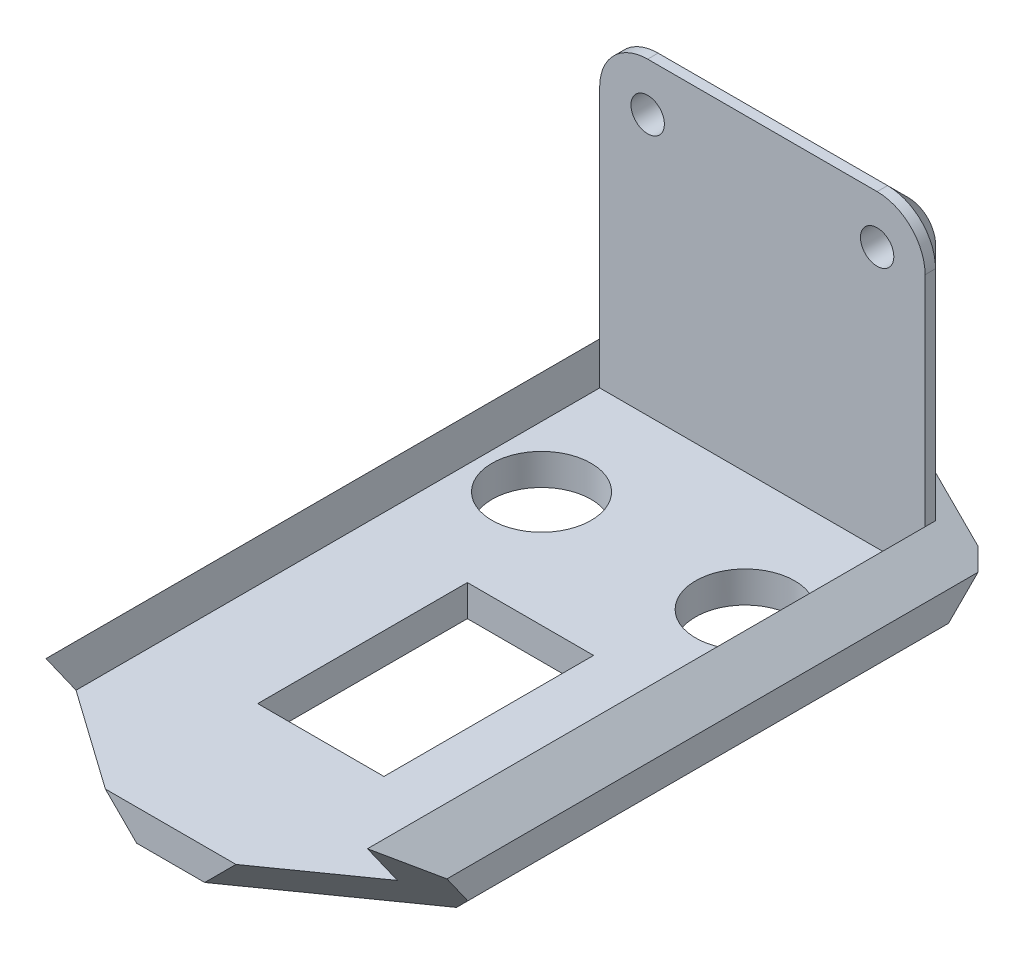
ISO-10303-21;
HEADER;
FILE_DESCRIPTION(('STEP AP214'),'2;1');
FILE_NAME('part.step','',(''),(''),'','','');
FILE_SCHEMA(('AUTOMOTIVE_DESIGN { 1 0 10303 214 1 1 1 1 }'));
ENDSEC;
DATA;
#1=APPLICATION_CONTEXT('core data for automotive mechanical design processes');
#2=APPLICATION_PROTOCOL_DEFINITION('international standard','automotive_design',2000,#1);
#3=PRODUCT_CONTEXT('',#1,'mechanical');
#4=PRODUCT('Part','Part','',(#3));
#5=PRODUCT_RELATED_PRODUCT_CATEGORY('part','',(#4));
#6=PRODUCT_DEFINITION_FORMATION('','',#4);
#7=PRODUCT_DEFINITION_CONTEXT('part definition',#1,'design');
#8=PRODUCT_DEFINITION('design','',#6,#7);
#9=PRODUCT_DEFINITION_SHAPE('','',#8);
#10=(LENGTH_UNIT() NAMED_UNIT(*) SI_UNIT(.MILLI.,.METRE.));
#11=(NAMED_UNIT(*) PLANE_ANGLE_UNIT() SI_UNIT($,.RADIAN.));
#12=(NAMED_UNIT(*) SI_UNIT($,.STERADIAN.) SOLID_ANGLE_UNIT());
#13=UNCERTAINTY_MEASURE_WITH_UNIT(LENGTH_MEASURE(1.E-05),#10,'distance_accuracy_value','');
#14=(GEOMETRIC_REPRESENTATION_CONTEXT(3) GLOBAL_UNCERTAINTY_ASSIGNED_CONTEXT((#13)) GLOBAL_UNIT_ASSIGNED_CONTEXT((#10,
#11,#12)) REPRESENTATION_CONTEXT('',''));
#15=CARTESIAN_POINT('',(0.,0.,0.));
#16=DIRECTION('',(0.,0.,1.));
#17=DIRECTION('',(1.,0.,0.));
#18=AXIS2_PLACEMENT_3D('',#15,#16,#17);
#19=CARTESIAN_POINT('',(0.,-25.,60.));
#20=DIRECTION('',(0.,-1.,0.));
#21=DIRECTION('',(0.,0.,-1.));
#22=AXIS2_PLACEMENT_3D('',#19,#20,#21);
#23=PLANE('',#22);
#24=CARTESIAN_POINT('',(9.76118306580784,-25.,14.4137382743566));
#25=DIRECTION('',(0.,-1.,0.));
#26=DIRECTION('',(0.,0.,-1.));
#27=AXIS2_PLACEMENT_3D('',#24,#25,#26);
#28=CIRCLE('',#27,4.75);
#29=CARTESIAN_POINT('',(9.76118306580784,-25.,9.66373827435661));
#30=VERTEX_POINT('',#29);
#31=EDGE_CURVE('E235',#30,#30,#28,.T.);
#32=ORIENTED_EDGE('',*,*,#31,.T.);
#33=EDGE_LOOP('',(#32));
#34=FACE_BOUND('',#33,.T.);
#35=CARTESIAN_POINT('',(-9.76118306580783,-25.,14.4137382743566));
#36=DIRECTION('',(0.,-1.,0.));
#37=DIRECTION('',(0.,0.,-1.));
#38=AXIS2_PLACEMENT_3D('',#35,#36,#37);
#39=CIRCLE('',#38,4.75);
#40=CARTESIAN_POINT('',(-9.76118306580783,-25.,9.66373827435661));
#41=VERTEX_POINT('',#40);
#42=EDGE_CURVE('E238',#41,#41,#39,.T.);
#43=ORIENTED_EDGE('',*,*,#42,.T.);
#44=EDGE_LOOP('',(#43));
#45=FACE_BOUND('',#44,.T.);
#46=DIRECTION('',(0.,0.,-1.));
#47=VECTOR('',#46,1.);
#48=CARTESIAN_POINT('',(-15.6,-25.,60.));
#49=LINE('',#48,#47);
#50=CARTESIAN_POINT('',(-15.6,-25.,53.2071067811864));
#51=VERTEX_POINT('',#50);
#52=CARTESIAN_POINT('',(-15.6,-25.,3.));
#53=VERTEX_POINT('',#52);
#54=EDGE_CURVE('E283',#51,#53,#49,.T.);
#55=ORIENTED_EDGE('',*,*,#54,.F.);
#56=DIRECTION('',(-0.81649658092773,0.,-0.57735026918962));
#57=VECTOR('',#56,1.);
#58=CARTESIAN_POINT('',(-12.3289321881343,-25.,55.5201010126776));
#59=LINE('',#58,#57);
#60=CARTESIAN_POINT('',(-5.99339828220145,-25.,60.));
#61=VERTEX_POINT('',#60);
#62=EDGE_CURVE('E416',#51,#61,#59,.F.);
#63=ORIENTED_EDGE('',*,*,#62,.T.);
#64=DIRECTION('',(-1.,0.,0.));
#65=VECTOR('',#64,1.);
#66=CARTESIAN_POINT('',(0.,-25.,60.));
#67=LINE('',#66,#65);
#68=CARTESIAN_POINT('',(6.52893218813444,-25.,60.));
#69=VERTEX_POINT('',#68);
#70=EDGE_CURVE('E276',#69,#61,#67,.T.);
#71=ORIENTED_EDGE('',*,*,#70,.F.);
#72=DIRECTION('',(0.816496580927725,0.,-0.577350269189628));
#73=VECTOR('',#72,1.);
#74=CARTESIAN_POINT('',(12.6859547920897,-25.,55.6463275648244));
#75=LINE('',#74,#73);
#76=CARTESIAN_POINT('',(15.6,-25.,53.5857864376268));
#77=VERTEX_POINT('',#76);
#78=EDGE_CURVE('E414',#69,#77,#75,.T.);
#79=ORIENTED_EDGE('',*,*,#78,.T.);
#80=DIRECTION('',(0.,0.,-1.));
#81=VECTOR('',#80,1.);
#82=CARTESIAN_POINT('',(15.6,-25.,60.));
#83=LINE('',#82,#81);
#84=CARTESIAN_POINT('',(15.6,-25.,3.));
#85=VERTEX_POINT('',#84);
#86=EDGE_CURVE('E282',#77,#85,#83,.T.);
#87=ORIENTED_EDGE('',*,*,#86,.T.);
#88=DIRECTION('',(1.,0.,0.));
#89=VECTOR('',#88,1.);
#90=CARTESIAN_POINT('',(0.,-25.,3.));
#91=LINE('',#90,#89);
#92=EDGE_CURVE('E296',#53,#85,#91,.T.);
#93=ORIENTED_EDGE('',*,*,#92,.F.);
#94=EDGE_LOOP('',(#55,#63,#71,#79,#87,#93));
#95=FACE_BOUND('',#94,.T.);
#96=DIRECTION('',(-1.,0.,0.));
#97=VECTOR('',#96,1.);
#98=CARTESIAN_POINT('',(0.,-25.,25.5031202897224));
#99=LINE('',#98,#97);
#100=CARTESIAN_POINT('',(6.31776695296641,-25.,25.5031202897224));
#101=VERTEX_POINT('',#100);
#102=CARTESIAN_POINT('',(-5.78223304703358,-25.,25.5031202897224));
#103=VERTEX_POINT('',#102);
#104=EDGE_CURVE('E216',#101,#103,#99,.T.);
#105=ORIENTED_EDGE('',*,*,#104,.F.);
#106=DIRECTION('',(0.,0.,-1.));
#107=VECTOR('',#106,1.);
#108=CARTESIAN_POINT('',(6.31776695296641,-25.,60.));
#109=LINE('',#108,#107);
#110=CARTESIAN_POINT('',(6.31776695296641,-25.,45.6031202897224));
#111=VERTEX_POINT('',#110);
#112=EDGE_CURVE('E219',#111,#101,#109,.T.);
#113=ORIENTED_EDGE('',*,*,#112,.F.);
#114=DIRECTION('',(-1.,0.,0.));
#115=VECTOR('',#114,1.);
#116=CARTESIAN_POINT('',(0.,-25.,45.6031202897224));
#117=LINE('',#116,#115);
#118=CARTESIAN_POINT('',(-5.78223304703358,-25.,45.6031202897224));
#119=VERTEX_POINT('',#118);
#120=EDGE_CURVE('E250',#111,#119,#117,.T.);
#121=ORIENTED_EDGE('',*,*,#120,.T.);
#122=DIRECTION('',(0.,0.,-1.));
#123=VECTOR('',#122,1.);
#124=CARTESIAN_POINT('',(-5.78223304703358,-25.,60.));
#125=LINE('',#124,#123);
#126=EDGE_CURVE('E253',#119,#103,#125,.T.);
#127=ORIENTED_EDGE('',*,*,#126,.T.);
#128=EDGE_LOOP('',(#105,#113,#121,#127));
#129=FACE_BOUND('',#128,.T.);
#130=ADVANCED_FACE('F41',(#34,#45,#95,#129),#23,.F.);
#131=CARTESIAN_POINT('',(0.,-28.,60.));
#132=DIRECTION('',(0.,1.,0.));
#133=DIRECTION('',(-1.,0.,0.));
#134=AXIS2_PLACEMENT_3D('',#131,#132,#133);
#135=PLANE('',#134);
#136=CARTESIAN_POINT('',(9.76118306580784,-28.,14.4137382743566));
#137=DIRECTION('',(0.,-1.,0.));
#138=DIRECTION('',(1.,0.,0.));
#139=AXIS2_PLACEMENT_3D('',#136,#137,#138);
#140=CIRCLE('',#139,4.75);
#141=CARTESIAN_POINT('',(14.5111830658078,-28.,14.4137382743566));
#142=VERTEX_POINT('',#141);
#143=EDGE_CURVE('E970',#142,#142,#140,.T.);
#144=ORIENTED_EDGE('',*,*,#143,.F.);
#145=EDGE_LOOP('',(#144));
#146=FACE_BOUND('',#145,.T.);
#147=CARTESIAN_POINT('',(-9.76118306580783,-28.,14.4137382743566));
#148=DIRECTION('',(0.,-1.,0.));
#149=DIRECTION('',(-1.,0.,0.));
#150=AXIS2_PLACEMENT_3D('',#147,#148,#149);
#151=CIRCLE('',#150,4.75);
#152=CARTESIAN_POINT('',(-14.5111830658078,-28.,14.4137382743566));
#153=VERTEX_POINT('',#152);
#154=EDGE_CURVE('E972',#153,#153,#151,.T.);
#155=ORIENTED_EDGE('',*,*,#154,.F.);
#156=EDGE_LOOP('',(#155));
#157=FACE_BOUND('',#156,.T.);
#158=DIRECTION('',(1.,0.,0.));
#159=VECTOR('',#158,1.);
#160=CARTESIAN_POINT('',(0.,-28.,60.));
#161=LINE('',#160,#159);
#162=CARTESIAN_POINT('',(-2.99339828220144,-28.,60.));
#163=VERTEX_POINT('',#162);
#164=CARTESIAN_POINT('',(3.52893218813454,-28.,60.));
#165=VERTEX_POINT('',#164);
#166=EDGE_CURVE('E279',#163,#165,#161,.T.);
#167=ORIENTED_EDGE('',*,*,#166,.F.);
#168=DIRECTION('',(0.81649658092773,0.,0.57735026918962));
#169=VECTOR('',#168,1.);
#170=CARTESIAN_POINT('',(-11.3289321881344,-28.,54.1058874503045));
#171=LINE('',#170,#169);
#172=CARTESIAN_POINT('',(-17.1355339059327,-28.,49.9999999999999));
#173=VERTEX_POINT('',#172);
#174=EDGE_CURVE('E404',#163,#173,#171,.F.);
#175=ORIENTED_EDGE('',*,*,#174,.T.);
#176=DIRECTION('',(0.,0.,-1.));
#177=VECTOR('',#176,1.);
#178=CARTESIAN_POINT('',(-17.1355339059327,-28.,5.));
#179=LINE('',#178,#177);
#180=CARTESIAN_POINT('',(-17.1355339059327,-28.,5.));
#181=VERTEX_POINT('',#180);
#182=EDGE_CURVE('E373',#173,#181,#179,.T.);
#183=ORIENTED_EDGE('',*,*,#182,.T.);
#184=DIRECTION('',(1.,0.,0.));
#185=VECTOR('',#184,1.);
#186=CARTESIAN_POINT('',(0.,-28.,5.));
#187=LINE('',#186,#185);
#188=CARTESIAN_POINT('',(17.6710678118655,-28.,5.));
#189=VERTEX_POINT('',#188);
#190=EDGE_CURVE('E326',#181,#189,#187,.T.);
#191=ORIENTED_EDGE('',*,*,#190,.T.);
#192=DIRECTION('',(0.,0.,1.));
#193=VECTOR('',#192,1.);
#194=CARTESIAN_POINT('',(17.6710678118655,-28.,60.));
#195=LINE('',#194,#193);
#196=CARTESIAN_POINT('',(17.6710678118655,-28.,49.9999999999999));
#197=VERTEX_POINT('',#196);
#198=EDGE_CURVE('E329',#189,#197,#195,.T.);
#199=ORIENTED_EDGE('',*,*,#198,.T.);
#200=DIRECTION('',(-0.816496580927725,0.,0.577350269189628));
#201=VECTOR('',#200,1.);
#202=CARTESIAN_POINT('',(11.6859547920897,-28.,54.2321140024513));
#203=LINE('',#202,#201);
#204=EDGE_CURVE('E402',#197,#165,#203,.T.);
#205=ORIENTED_EDGE('',*,*,#204,.T.);
#206=EDGE_LOOP('',(#167,#175,#183,#191,#199,#205));
#207=FACE_BOUND('',#206,.T.);
#208=DIRECTION('',(-1.,0.,0.));
#209=VECTOR('',#208,1.);
#210=CARTESIAN_POINT('',(6.31776695296641,-28.,25.5031202897224));
#211=LINE('',#210,#209);
#212=CARTESIAN_POINT('',(6.31776695296641,-28.,25.5031202897224));
#213=VERTEX_POINT('',#212);
#214=CARTESIAN_POINT('',(-5.78223304703358,-28.,25.5031202897224));
#215=VERTEX_POINT('',#214);
#216=EDGE_CURVE('E213',#213,#215,#211,.T.);
#217=ORIENTED_EDGE('',*,*,#216,.T.);
#218=DIRECTION('',(0.,0.,-1.));
#219=VECTOR('',#218,1.);
#220=CARTESIAN_POINT('',(-5.78223304703358,-28.,45.6031202897224));
#221=LINE('',#220,#219);
#222=CARTESIAN_POINT('',(-5.78223304703358,-28.,45.6031202897224));
#223=VERTEX_POINT('',#222);
#224=EDGE_CURVE('E223',#223,#215,#221,.T.);
#225=ORIENTED_EDGE('',*,*,#224,.F.);
#226=DIRECTION('',(-1.,0.,0.));
#227=VECTOR('',#226,1.);
#228=CARTESIAN_POINT('',(6.31776695296641,-28.,45.6031202897224));
#229=LINE('',#228,#227);
#230=CARTESIAN_POINT('',(6.31776695296641,-28.,45.6031202897224));
#231=VERTEX_POINT('',#230);
#232=EDGE_CURVE('E229',#231,#223,#229,.T.);
#233=ORIENTED_EDGE('',*,*,#232,.F.);
#234=DIRECTION('',(0.,0.,-1.));
#235=VECTOR('',#234,1.);
#236=CARTESIAN_POINT('',(6.31776695296641,-28.,45.6031202897224));
#237=LINE('',#236,#235);
#238=EDGE_CURVE('E234',#231,#213,#237,.T.);
#239=ORIENTED_EDGE('',*,*,#238,.T.);
#240=EDGE_LOOP('',(#217,#225,#233,#239));
#241=FACE_BOUND('',#240,.T.);
#242=ADVANCED_FACE('F232',(#146,#157,#207,#241),#135,.F.);
#243=CARTESIAN_POINT('',(-15.6,0.,3.));
#244=DIRECTION('',(1.,0.,0.));
#245=DIRECTION('',(0.,1.,0.));
#246=AXIS2_PLACEMENT_3D('',#243,#244,#245);
#247=PLANE('',#246);
#248=DIRECTION('',(0.,0.,-1.));
#249=VECTOR('',#248,1.);
#250=CARTESIAN_POINT('',(-15.6,0.,3.));
#251=LINE('',#250,#249);
#252=CARTESIAN_POINT('',(-15.6,0.,3.));
#253=VERTEX_POINT('',#252);
#254=CARTESIAN_POINT('',(-15.6,0.,2.00000000000002));
#255=VERTEX_POINT('',#254);
#256=EDGE_CURVE('E320',#253,#255,#251,.T.);
#257=ORIENTED_EDGE('',*,*,#256,.T.);
#258=DIRECTION('',(0.,-1.,0.));
#259=VECTOR('',#258,1.);
#260=CARTESIAN_POINT('',(-15.6,0.,2.00000000000002));
#261=LINE('',#260,#259);
#262=CARTESIAN_POINT('',(-15.6,-20.9289321881346,2.00000000000002));
#263=VERTEX_POINT('',#262);
#264=EDGE_CURVE('E342',#255,#263,#261,.T.);
#265=ORIENTED_EDGE('',*,*,#264,.T.);
#266=DIRECTION('',(0.,0.,-1.));
#267=VECTOR('',#266,1.);
#268=CARTESIAN_POINT('',(-15.6,-20.9289321881346,70.));
#269=LINE('',#268,#267);
#270=CARTESIAN_POINT('',(-15.6,-20.9289321881346,3.));
#271=VERTEX_POINT('',#270);
#272=EDGE_CURVE('E260',#271,#263,#269,.T.);
#273=ORIENTED_EDGE('',*,*,#272,.F.);
#274=DIRECTION('',(0.,-1.,0.));
#275=VECTOR('',#274,1.);
#276=CARTESIAN_POINT('',(-15.6,0.,3.));
#277=LINE('',#276,#275);
#278=EDGE_CURVE('E293',#253,#271,#277,.T.);
#279=ORIENTED_EDGE('',*,*,#278,.F.);
#280=EDGE_LOOP('',(#257,#265,#273,#279));
#281=FACE_BOUND('',#280,.T.);
#282=ADVANCED_FACE('F507',(#281),#247,.F.);
#283=CARTESIAN_POINT('',(0.,4.6,3.));
#284=DIRECTION('',(0.,1.,0.));
#285=DIRECTION('',(0.,0.,1.));
#286=AXIS2_PLACEMENT_3D('',#283,#284,#285);
#287=PLANE('',#286);
#288=DIRECTION('',(0.,0.,-1.));
#289=VECTOR('',#288,1.);
#290=CARTESIAN_POINT('',(11.,4.6,3.));
#291=LINE('',#290,#289);
#292=CARTESIAN_POINT('',(11.,4.6,3.));
#293=VERTEX_POINT('',#292);
#294=CARTESIAN_POINT('',(11.,4.6,2.00000000000002));
#295=VERTEX_POINT('',#294);
#296=EDGE_CURVE('E310',#293,#295,#291,.T.);
#297=ORIENTED_EDGE('',*,*,#296,.T.);
#298=DIRECTION('',(-1.,0.,0.));
#299=VECTOR('',#298,1.);
#300=CARTESIAN_POINT('',(-11.,4.6,2.00000000000002));
#301=LINE('',#300,#299);
#302=CARTESIAN_POINT('',(-11.,4.6,2.00000000000002));
#303=VERTEX_POINT('',#302);
#304=EDGE_CURVE('E362',#295,#303,#301,.T.);
#305=ORIENTED_EDGE('',*,*,#304,.T.);
#306=DIRECTION('',(0.,0.,-1.));
#307=VECTOR('',#306,1.);
#308=CARTESIAN_POINT('',(-11.,4.6,3.));
#309=LINE('',#308,#307);
#310=CARTESIAN_POINT('',(-11.,4.6,3.));
#311=VERTEX_POINT('',#310);
#312=EDGE_CURVE('E323',#311,#303,#309,.T.);
#313=ORIENTED_EDGE('',*,*,#312,.F.);
#314=DIRECTION('',(1.,0.,0.));
#315=VECTOR('',#314,1.);
#316=CARTESIAN_POINT('',(0.,4.6,3.));
#317=LINE('',#316,#315);
#318=EDGE_CURVE('E287',#311,#293,#317,.T.);
#319=ORIENTED_EDGE('',*,*,#318,.T.);
#320=EDGE_LOOP('',(#297,#305,#313,#319));
#321=FACE_BOUND('',#320,.T.);
#322=ADVANCED_FACE('F553',(#321),#287,.T.);
#323=CARTESIAN_POINT('',(-11.,0.,3.));
#324=DIRECTION('',(0.,0.,-1.));
#325=DIRECTION('',(-1.,0.,0.));
#326=AXIS2_PLACEMENT_3D('',#323,#324,#325);
#327=CYLINDRICAL_SURFACE('',#326,4.6);
#328=ORIENTED_EDGE('',*,*,#312,.T.);
#329=CARTESIAN_POINT('',(-11.,0.,2.00000000000002));
#330=DIRECTION('',(0.,0.,1.));
#331=DIRECTION('',(1.,0.,0.));
#332=AXIS2_PLACEMENT_3D('',#329,#330,#331);
#333=CIRCLE('',#332,4.6);
#334=EDGE_CURVE('E360',#303,#255,#333,.T.);
#335=ORIENTED_EDGE('',*,*,#334,.T.);
#336=ORIENTED_EDGE('',*,*,#256,.F.);
#337=CARTESIAN_POINT('',(-11.,0.,3.));
#338=DIRECTION('',(0.,0.,1.));
#339=DIRECTION('',(1.,0.,0.));
#340=AXIS2_PLACEMENT_3D('',#337,#338,#339);
#341=CIRCLE('',#340,4.6);
#342=EDGE_CURVE('E290',#311,#253,#341,.T.);
#343=ORIENTED_EDGE('',*,*,#342,.F.);
#344=EDGE_LOOP('',(#328,#335,#336,#343));
#345=FACE_BOUND('',#344,.T.);
#346=ADVANCED_FACE('F550',(#345),#327,.T.);
#347=CARTESIAN_POINT('',(15.6,0.,3.));
#348=DIRECTION('',(1.,0.,0.));
#349=DIRECTION('',(0.,1.,0.));
#350=AXIS2_PLACEMENT_3D('',#347,#348,#349);
#351=PLANE('',#350);
#352=DIRECTION('',(0.,0.,-1.));
#353=VECTOR('',#352,1.);
#354=CARTESIAN_POINT('',(15.6,-20.9289321881346,70.));
#355=LINE('',#354,#353);
#356=CARTESIAN_POINT('',(15.6,-20.9289321881346,3.));
#357=VERTEX_POINT('',#356);
#358=CARTESIAN_POINT('',(15.6,-20.9289321881346,2.00000000000002));
#359=VERTEX_POINT('',#358);
#360=EDGE_CURVE('E270',#357,#359,#355,.T.);
#361=ORIENTED_EDGE('',*,*,#360,.T.);
#362=DIRECTION('',(0.,1.,0.));
#363=VECTOR('',#362,1.);
#364=CARTESIAN_POINT('',(15.6,0.,2.00000000000002));
#365=LINE('',#364,#363);
#366=CARTESIAN_POINT('',(15.6,0.,2.00000000000002));
#367=VERTEX_POINT('',#366);
#368=EDGE_CURVE('E366',#359,#367,#365,.T.);
#369=ORIENTED_EDGE('',*,*,#368,.T.);
#370=DIRECTION('',(0.,0.,-1.));
#371=VECTOR('',#370,1.);
#372=CARTESIAN_POINT('',(15.6,0.,3.));
#373=LINE('',#372,#371);
#374=CARTESIAN_POINT('',(15.6,0.,3.));
#375=VERTEX_POINT('',#374);
#376=EDGE_CURVE('E317',#375,#367,#373,.T.);
#377=ORIENTED_EDGE('',*,*,#376,.F.);
#378=DIRECTION('',(0.,-1.,0.));
#379=VECTOR('',#378,1.);
#380=CARTESIAN_POINT('',(15.6,0.,3.));
#381=LINE('',#380,#379);
#382=EDGE_CURVE('E299',#375,#357,#381,.T.);
#383=ORIENTED_EDGE('',*,*,#382,.T.);
#384=EDGE_LOOP('',(#361,#369,#377,#383));
#385=FACE_BOUND('',#384,.T.);
#386=ADVANCED_FACE('F460',(#385),#351,.T.);
#387=CARTESIAN_POINT('',(-11.,0.,3.));
#388=DIRECTION('',(0.,0.,-1.));
#389=DIRECTION('',(-1.,0.,0.));
#390=AXIS2_PLACEMENT_3D('',#387,#388,#389);
#391=CYLINDRICAL_SURFACE('',#390,1.6);
#392=CARTESIAN_POINT('',(-11.,0.,3.));
#393=DIRECTION('',(0.,0.,1.));
#394=DIRECTION('',(1.,0.,0.));
#395=AXIS2_PLACEMENT_3D('',#392,#393,#394);
#396=CIRCLE('',#395,1.6);
#397=CARTESIAN_POINT('',(-9.4,0.,3.));
#398=VERTEX_POINT('',#397);
#399=EDGE_CURVE('E304',#398,#398,#396,.T.);
#400=ORIENTED_EDGE('',*,*,#399,.T.);
#401=EDGE_LOOP('',(#400));
#402=FACE_BOUND('',#401,.T.);
#403=CARTESIAN_POINT('',(-11.,0.,0.));
#404=DIRECTION('',(0.,0.,1.));
#405=DIRECTION('',(1.,0.,0.));
#406=AXIS2_PLACEMENT_3D('',#403,#404,#405);
#407=CIRCLE('',#406,1.6);
#408=CARTESIAN_POINT('',(-9.4,0.,0.));
#409=VERTEX_POINT('',#408);
#410=EDGE_CURVE('E285',#409,#409,#407,.T.);
#411=ORIENTED_EDGE('',*,*,#410,.F.);
#412=EDGE_LOOP('',(#411));
#413=FACE_BOUND('',#412,.T.);
#414=ADVANCED_FACE('F541',(#402,#413),#391,.F.);
#415=CARTESIAN_POINT('',(11.,0.,3.));
#416=DIRECTION('',(0.,0.,-1.));
#417=DIRECTION('',(-1.,0.,0.));
#418=AXIS2_PLACEMENT_3D('',#415,#416,#417);
#419=CYLINDRICAL_SURFACE('',#418,4.6);
#420=ORIENTED_EDGE('',*,*,#376,.T.);
#421=CARTESIAN_POINT('',(11.,0.,2.00000000000002));
#422=DIRECTION('',(0.,0.,1.));
#423=DIRECTION('',(1.,0.,0.));
#424=AXIS2_PLACEMENT_3D('',#421,#422,#423);
#425=CIRCLE('',#424,4.6);
#426=EDGE_CURVE('E364',#367,#295,#425,.T.);
#427=ORIENTED_EDGE('',*,*,#426,.T.);
#428=ORIENTED_EDGE('',*,*,#296,.F.);
#429=CARTESIAN_POINT('',(11.,0.,3.));
#430=DIRECTION('',(0.,0.,1.));
#431=DIRECTION('',(1.,0.,0.));
#432=AXIS2_PLACEMENT_3D('',#429,#430,#431);
#433=CIRCLE('',#432,4.6);
#434=EDGE_CURVE('E302',#375,#293,#433,.T.);
#435=ORIENTED_EDGE('',*,*,#434,.F.);
#436=EDGE_LOOP('',(#420,#427,#428,#435));
#437=FACE_BOUND('',#436,.T.);
#438=ADVANCED_FACE('F539',(#437),#419,.T.);
#439=CARTESIAN_POINT('',(11.,0.,3.));
#440=DIRECTION('',(0.,0.,-1.));
#441=DIRECTION('',(-1.,0.,0.));
#442=AXIS2_PLACEMENT_3D('',#439,#440,#441);
#443=CYLINDRICAL_SURFACE('',#442,1.6);
#444=CARTESIAN_POINT('',(11.,0.,3.));
#445=DIRECTION('',(0.,0.,1.));
#446=DIRECTION('',(1.,0.,0.));
#447=AXIS2_PLACEMENT_3D('',#444,#445,#446);
#448=CIRCLE('',#447,1.6);
#449=CARTESIAN_POINT('',(12.6,0.,3.));
#450=VERTEX_POINT('',#449);
#451=EDGE_CURVE('E307',#450,#450,#448,.T.);
#452=ORIENTED_EDGE('',*,*,#451,.T.);
#453=EDGE_LOOP('',(#452));
#454=FACE_BOUND('',#453,.T.);
#455=CARTESIAN_POINT('',(11.,0.,0.));
#456=DIRECTION('',(0.,0.,1.));
#457=DIRECTION('',(1.,0.,0.));
#458=AXIS2_PLACEMENT_3D('',#455,#456,#457);
#459=CIRCLE('',#458,1.6);
#460=CARTESIAN_POINT('',(12.6,0.,0.));
#461=VERTEX_POINT('',#460);
#462=EDGE_CURVE('E291',#461,#461,#459,.T.);
#463=ORIENTED_EDGE('',*,*,#462,.F.);
#464=EDGE_LOOP('',(#463));
#465=FACE_BOUND('',#464,.T.);
#466=ADVANCED_FACE('F534',(#454,#465),#443,.F.);
#467=CARTESIAN_POINT('',(0.,0.,3.));
#468=DIRECTION('',(0.,0.,1.));
#469=DIRECTION('',(1.,0.,0.));
#470=AXIS2_PLACEMENT_3D('',#467,#468,#469);
#471=PLANE('',#470);
#472=ORIENTED_EDGE('',*,*,#318,.F.);
#473=ORIENTED_EDGE('',*,*,#342,.T.);
#474=ORIENTED_EDGE('',*,*,#278,.T.);
#475=DIRECTION('',(0.,-1.,0.));
#476=VECTOR('',#475,1.);
#477=CARTESIAN_POINT('',(-15.6,0.,3.));
#478=LINE('',#477,#476);
#479=EDGE_CURVE('E264',#271,#53,#478,.T.);
#480=ORIENTED_EDGE('',*,*,#479,.T.);
#481=ORIENTED_EDGE('',*,*,#92,.T.);
#482=DIRECTION('',(0.,1.,0.));
#483=VECTOR('',#482,1.);
#484=CARTESIAN_POINT('',(15.6,0.,3.));
#485=LINE('',#484,#483);
#486=EDGE_CURVE('E273',#85,#357,#485,.T.);
#487=ORIENTED_EDGE('',*,*,#486,.T.);
#488=ORIENTED_EDGE('',*,*,#382,.F.);
#489=ORIENTED_EDGE('',*,*,#434,.T.);
#490=EDGE_LOOP('',(#472,#473,#474,#480,#481,#487,#488,#489));
#491=FACE_BOUND('',#490,.T.);
#492=ORIENTED_EDGE('',*,*,#399,.F.);
#493=EDGE_LOOP('',(#492));
#494=FACE_BOUND('',#493,.T.);
#495=ORIENTED_EDGE('',*,*,#451,.F.);
#496=EDGE_LOOP('',(#495));
#497=FACE_BOUND('',#496,.T.);
#498=ADVANCED_FACE('F465',(#491,#494,#497),#471,.T.);
#499=CARTESIAN_POINT('',(0.,0.,0.));
#500=DIRECTION('',(0.,0.,1.));
#501=DIRECTION('',(1.,0.,0.));
#502=AXIS2_PLACEMENT_3D('',#499,#500,#501);
#503=PLANE('',#502);
#504=DIRECTION('',(-0.707106781186551,-0.707106781186544,0.));
#505=VECTOR('',#504,1.);
#506=CARTESIAN_POINT('',(2.66446609406737,-2.6644660940674,0.));
#507=LINE('',#506,#505);
#508=CARTESIAN_POINT('',(-13.6,-18.9289321881346,0.));
#509=VERTEX_POINT('',#508);
#510=CARTESIAN_POINT('',(-17.6710678118654,-23.,0.));
#511=VERTEX_POINT('',#510);
#512=EDGE_CURVE('E257',#509,#511,#507,.T.);
#513=ORIENTED_EDGE('',*,*,#512,.F.);
#514=DIRECTION('',(0.,1.,0.));
#515=VECTOR('',#514,1.);
#516=CARTESIAN_POINT('',(-13.6,0.,0.));
#517=LINE('',#516,#515);
#518=CARTESIAN_POINT('',(-13.6,0.,0.));
#519=VERTEX_POINT('',#518);
#520=EDGE_CURVE('E358',#509,#519,#517,.T.);
#521=ORIENTED_EDGE('',*,*,#520,.T.);
#522=CARTESIAN_POINT('',(-11.,0.,0.));
#523=DIRECTION('',(0.,0.,1.));
#524=DIRECTION('',(1.,0.,0.));
#525=AXIS2_PLACEMENT_3D('',#522,#523,#524);
#526=CIRCLE('',#525,2.59999999999999);
#527=CARTESIAN_POINT('',(-11.,2.59999999999999,0.));
#528=VERTEX_POINT('',#527);
#529=EDGE_CURVE('E356',#519,#528,#526,.F.);
#530=ORIENTED_EDGE('',*,*,#529,.T.);
#531=DIRECTION('',(1.,0.,0.));
#532=VECTOR('',#531,1.);
#533=CARTESIAN_POINT('',(11.,2.59999999999999,0.));
#534=LINE('',#533,#532);
#535=CARTESIAN_POINT('',(11.,2.59999999999999,0.));
#536=VERTEX_POINT('',#535);
#537=EDGE_CURVE('E354',#528,#536,#534,.T.);
#538=ORIENTED_EDGE('',*,*,#537,.T.);
#539=CARTESIAN_POINT('',(11.,0.,0.));
#540=DIRECTION('',(0.,0.,1.));
#541=DIRECTION('',(1.,0.,0.));
#542=AXIS2_PLACEMENT_3D('',#539,#540,#541);
#543=CIRCLE('',#542,2.59999999999999);
#544=CARTESIAN_POINT('',(13.6,0.,0.));
#545=VERTEX_POINT('',#544);
#546=EDGE_CURVE('E352',#536,#545,#543,.F.);
#547=ORIENTED_EDGE('',*,*,#546,.T.);
#548=DIRECTION('',(0.,-1.,0.));
#549=VECTOR('',#548,1.);
#550=CARTESIAN_POINT('',(13.6,-20.9289321881346,0.));
#551=LINE('',#550,#549);
#552=CARTESIAN_POINT('',(13.6,-18.9289321881346,0.));
#553=VERTEX_POINT('',#552);
#554=EDGE_CURVE('E349',#545,#553,#551,.T.);
#555=ORIENTED_EDGE('',*,*,#554,.T.);
#556=DIRECTION('',(0.707106781186551,-0.707106781186544,0.));
#557=VECTOR('',#556,1.);
#558=CARTESIAN_POINT('',(-2.66446609406737,-2.6644660940674,0.));
#559=LINE('',#558,#557);
#560=CARTESIAN_POINT('',(17.6710678118654,-23.,0.));
#561=VERTEX_POINT('',#560);
#562=EDGE_CURVE('E267',#553,#561,#559,.T.);
#563=ORIENTED_EDGE('',*,*,#562,.T.);
#564=DIRECTION('',(-1.,0.,0.));
#565=VECTOR('',#564,1.);
#566=CARTESIAN_POINT('',(0.,-23.,0.));
#567=LINE('',#566,#565);
#568=EDGE_CURVE('E334',#561,#511,#567,.T.);
#569=ORIENTED_EDGE('',*,*,#568,.T.);
#570=EDGE_LOOP('',(#513,#521,#530,#538,#547,#555,#563,#569));
#571=FACE_BOUND('',#570,.T.);
#572=ORIENTED_EDGE('',*,*,#410,.T.);
#573=EDGE_LOOP('',(#572));
#574=FACE_BOUND('',#573,.T.);
#575=ORIENTED_EDGE('',*,*,#462,.T.);
#576=EDGE_LOOP('',(#575));
#577=FACE_BOUND('',#576,.T.);
#578=ADVANCED_FACE('F450',(#571,#574,#577),#503,.F.);
#579=CARTESIAN_POINT('',(0.,0.,60.));
#580=DIRECTION('',(0.,0.,-1.));
#581=DIRECTION('',(-1.,0.,0.));
#582=AXIS2_PLACEMENT_3D('',#579,#580,#581);
#583=PLANE('',#582);
#584=ORIENTED_EDGE('',*,*,#70,.T.);
#585=DIRECTION('',(0.70710678118655,-0.707106781186545,0.));
#586=VECTOR('',#585,1.);
#587=CARTESIAN_POINT('',(-10.0644660940671,-20.9289321881344,60.));
#588=LINE('',#587,#586);
#589=EDGE_CURVE('E399',#61,#163,#588,.T.);
#590=ORIENTED_EDGE('',*,*,#589,.T.);
#591=ORIENTED_EDGE('',*,*,#166,.T.);
#592=DIRECTION('',(0.707106781186537,0.707106781186558,0.));
#593=VECTOR('',#592,1.);
#594=CARTESIAN_POINT('',(11.6857864376267,-19.8431457505076,60.));
#595=LINE('',#594,#593);
#596=EDGE_CURVE('E396',#165,#69,#595,.T.);
#597=ORIENTED_EDGE('',*,*,#596,.T.);
#598=EDGE_LOOP('',(#584,#590,#591,#597));
#599=FACE_BOUND('',#598,.T.);
#600=ADVANCED_FACE('F476',(#599),#583,.F.);
#601=CARTESIAN_POINT('',(-2.66446609406737,-2.6644660940674,70.));
#602=DIRECTION('',(0.707106781186544,0.707106781186551,0.));
#603=DIRECTION('',(-0.707106781186551,0.707106781186544,0.));
#604=AXIS2_PLACEMENT_3D('',#601,#602,#603);
#605=PLANE('',#604);
#606=CARTESIAN_POINT('',(15.6,-20.9289321881346,56.4644660940671));
#607=VERTEX_POINT('',#606);
#608=EDGE_CURVE('E271',#607,#357,#355,.T.);
#609=ORIENTED_EDGE('',*,*,#608,.F.);
#610=DIRECTION('',(0.500000000000005,-0.5,-0.707106781186544));
#611=VECTOR('',#610,1.);
#612=CARTESIAN_POINT('',(1.68223304703339,-7.0111652351681,76.1471608769002));
#613=LINE('',#612,#611);
#614=CARTESIAN_POINT('',(18.7568542494923,-24.0857864376269,51.9999999999999));
#615=VERTEX_POINT('',#614);
#616=EDGE_CURVE('E64',#607,#615,#613,.T.);
#617=ORIENTED_EDGE('',*,*,#616,.T.);
#618=DIRECTION('',(0.,0.,-1.));
#619=VECTOR('',#618,1.);
#620=CARTESIAN_POINT('',(18.7568542494923,-24.0857864376269,70.));
#621=LINE('',#620,#619);
#622=CARTESIAN_POINT('',(18.7568542494923,-24.0857864376269,1.08578643762689));
#623=VERTEX_POINT('',#622);
#624=EDGE_CURVE('E390',#615,#623,#621,.T.);
#625=ORIENTED_EDGE('',*,*,#624,.T.);
#626=DIRECTION('',(0.577350269189631,-0.577350269189625,0.577350269189622));
#627=VECTOR('',#626,1.);
#628=CARTESIAN_POINT('',(27.4473785412435,-32.776310729378,9.77631072937794));
#629=LINE('',#628,#627);
#630=EDGE_CURVE('E332',#623,#561,#629,.F.);
#631=ORIENTED_EDGE('',*,*,#630,.T.);
#632=ORIENTED_EDGE('',*,*,#562,.F.);
#633=DIRECTION('',(0.577350269189627,-0.577350269189621,0.577350269189629));
#634=VECTOR('',#633,1.);
#635=CARTESIAN_POINT('',(7.2903559372885,-12.6192881254232,-6.30964406271151));
#636=LINE('',#635,#634);
#637=EDGE_CURVE('E371',#553,#359,#636,.T.);
#638=ORIENTED_EDGE('',*,*,#637,.T.);
#639=ORIENTED_EDGE('',*,*,#360,.F.);
#640=EDGE_LOOP('',(#609,#617,#625,#631,#632,#638,#639));
#641=FACE_BOUND('',#640,.T.);
#642=ADVANCED_FACE('F427',(#641),#605,.T.);
#643=CARTESIAN_POINT('',(15.6,0.,70.));
#644=DIRECTION('',(1.,0.,0.));
#645=DIRECTION('',(0.,1.,0.));
#646=AXIS2_PLACEMENT_3D('',#643,#644,#645);
#647=PLANE('',#646);
#648=ORIENTED_EDGE('',*,*,#86,.F.);
#649=DIRECTION('',(0.,0.816496580927733,0.577350269189616));
#650=VECTOR('',#649,1.);
#651=CARTESIAN_POINT('',(15.6,-15.8192881254226,60.0775300602602));
#652=LINE('',#651,#650);
#653=EDGE_CURVE('E418',#77,#607,#652,.T.);
#654=ORIENTED_EDGE('',*,*,#653,.T.);
#655=ORIENTED_EDGE('',*,*,#608,.T.);
#656=ORIENTED_EDGE('',*,*,#486,.F.);
#657=EDGE_LOOP('',(#648,#654,#655,#656));
#658=FACE_BOUND('',#657,.T.);
#659=ADVANCED_FACE('F423',(#658),#647,.F.);
#660=CARTESIAN_POINT('',(-15.6,0.,70.));
#661=DIRECTION('',(-1.,0.,0.));
#662=DIRECTION('',(0.,-1.,0.));
#663=AXIS2_PLACEMENT_3D('',#660,#661,#662);
#664=PLANE('',#663);
#665=CARTESIAN_POINT('',(-15.6,-20.9289321881346,56.0857864376267));
#666=VERTEX_POINT('',#665);
#667=EDGE_CURVE('E262',#666,#271,#269,.T.);
#668=ORIENTED_EDGE('',*,*,#667,.F.);
#669=DIRECTION('',(0.,0.816496580927728,0.577350269189623));
#670=VECTOR('',#669,1.);
#671=CARTESIAN_POINT('',(-15.6,-15.4622655214677,59.9513035081133));
#672=LINE('',#671,#670);
#673=EDGE_CURVE('E412',#666,#51,#672,.F.);
#674=ORIENTED_EDGE('',*,*,#673,.T.);
#675=ORIENTED_EDGE('',*,*,#54,.T.);
#676=ORIENTED_EDGE('',*,*,#479,.F.);
#677=EDGE_LOOP('',(#668,#674,#675,#676));
#678=FACE_BOUND('',#677,.T.);
#679=ADVANCED_FACE('F511',(#678),#664,.F.);
#680=CARTESIAN_POINT('',(2.66446609406737,-2.6644660940674,70.));
#681=DIRECTION('',(0.707106781186544,-0.707106781186551,0.));
#682=DIRECTION('',(0.707106781186551,0.707106781186544,0.));
#683=AXIS2_PLACEMENT_3D('',#680,#681,#682);
#684=PLANE('',#683);
#685=DIRECTION('',(0.,0.,1.));
#686=VECTOR('',#685,1.);
#687=CARTESIAN_POINT('',(-19.1355339059327,-24.4644660940673,70.));
#688=LINE('',#687,#686);
#689=CARTESIAN_POINT('',(-19.1355339059327,-24.4644660940673,1.46446609406728));
#690=VERTEX_POINT('',#689);
#691=CARTESIAN_POINT('',(-19.1355339059327,-24.4644660940673,51.0857864376268));
#692=VERTEX_POINT('',#691);
#693=EDGE_CURVE('E336',#690,#692,#688,.T.);
#694=ORIENTED_EDGE('',*,*,#693,.T.);
#695=DIRECTION('',(-0.500000000000005,-0.5,-0.707106781186544));
#696=VECTOR('',#695,1.);
#697=CARTESIAN_POINT('',(-12.8322330470335,-18.1611652351681,60.));
#698=LINE('',#697,#696);
#699=EDGE_CURVE('E410',#692,#666,#698,.F.);
#700=ORIENTED_EDGE('',*,*,#699,.T.);
#701=ORIENTED_EDGE('',*,*,#667,.T.);
#702=ORIENTED_EDGE('',*,*,#272,.T.);
#703=DIRECTION('',(-0.577350269189627,-0.577350269189621,0.577350269189629));
#704=VECTOR('',#703,1.);
#705=CARTESIAN_POINT('',(-26.0903559372887,-31.4192881254231,12.4903559372887));
#706=LINE('',#705,#704);
#707=EDGE_CURVE('E368',#263,#509,#706,.F.);
#708=ORIENTED_EDGE('',*,*,#707,.T.);
#709=ORIENTED_EDGE('',*,*,#512,.T.);
#710=DIRECTION('',(0.577350269189631,0.577350269189624,-0.577350269189622));
#711=VECTOR('',#710,1.);
#712=CARTESIAN_POINT('',(-15.1140452079102,-20.4429773960448,-2.55702260395518));
#713=LINE('',#712,#711);
#714=EDGE_CURVE('E339',#511,#690,#713,.F.);
#715=ORIENTED_EDGE('',*,*,#714,.T.);
#716=EDGE_LOOP('',(#694,#700,#701,#702,#708,#709,#715));
#717=FACE_BOUND('',#716,.T.);
#718=ADVANCED_FACE('F491',(#717),#684,.F.);
#719=CARTESIAN_POINT('',(-19.1355339059327,-28.,60.));
#720=DIRECTION('',(1.,0.,0.));
#721=DIRECTION('',(0.,0.,-1.));
#722=AXIS2_PLACEMENT_3D('',#719,#720,#721);
#723=PLANE('',#722);
#724=DIRECTION('',(0.,0.,-1.));
#725=VECTOR('',#724,1.);
#726=CARTESIAN_POINT('',(-19.1355339059327,-26.,60.));
#727=LINE('',#726,#725);
#728=CARTESIAN_POINT('',(-19.1355339059327,-26.,3.));
#729=VERTEX_POINT('',#728);
#730=CARTESIAN_POINT('',(-19.1355339059327,-26.,49.9999999999999));
#731=VERTEX_POINT('',#730);
#732=EDGE_CURVE('E387',#729,#731,#727,.F.);
#733=ORIENTED_EDGE('',*,*,#732,.T.);
#734=DIRECTION('',(0.,0.816496580927729,0.577350269189621));
#735=VECTOR('',#734,1.);
#736=CARTESIAN_POINT('',(-19.1355339059327,-22.619288125423,52.3905242917512));
#737=LINE('',#736,#735);
#738=EDGE_CURVE('E408',#731,#692,#737,.T.);
#739=ORIENTED_EDGE('',*,*,#738,.T.);
#740=ORIENTED_EDGE('',*,*,#693,.F.);
#741=DIRECTION('',(0.,-0.707106781186549,0.707106781186546));
#742=VECTOR('',#741,1.);
#743=CARTESIAN_POINT('',(-19.1355339059325,-55.5,32.4999999999999));
#744=LINE('',#743,#742);
#745=EDGE_CURVE('E261',#729,#690,#744,.F.);
#746=ORIENTED_EDGE('',*,*,#745,.F.);
#747=EDGE_LOOP('',(#733,#739,#740,#746));
#748=FACE_BOUND('',#747,.T.);
#749=ADVANCED_FACE('F489',(#748),#723,.F.);
#750=CARTESIAN_POINT('',(20.1710678118655,-25.5,70.));
#751=DIRECTION('',(0.707106781186558,-0.707106781186537,0.));
#752=DIRECTION('',(0.,0.,1.));
#753=AXIS2_PLACEMENT_3D('',#750,#751,#752);
#754=PLANE('',#753);
#755=DIRECTION('',(0.,0.,1.));
#756=VECTOR('',#755,1.);
#757=CARTESIAN_POINT('',(18.7568542494924,-26.9142135623731,70.));
#758=LINE('',#757,#756);
#759=CARTESIAN_POINT('',(18.7568542494924,-26.9142135623731,3.91421356237311));
#760=VERTEX_POINT('',#759);
#761=CARTESIAN_POINT('',(18.7568542494924,-26.9142135623731,49.9999999999999));
#762=VERTEX_POINT('',#761);
#763=EDGE_CURVE('E394',#760,#762,#758,.T.);
#764=ORIENTED_EDGE('',*,*,#763,.T.);
#765=DIRECTION('',(-0.707106781186537,-0.707106781186558,0.));
#766=VECTOR('',#765,1.);
#767=CARTESIAN_POINT('',(17.6710678118655,-28.,49.9999999999999));
#768=LINE('',#767,#766);
#769=EDGE_CURVE('E11',#762,#197,#768,.T.);
#770=ORIENTED_EDGE('',*,*,#769,.T.);
#771=ORIENTED_EDGE('',*,*,#198,.F.);
#772=DIRECTION('',(-0.577350269189615,-0.577350269189633,0.57735026918963));
#773=VECTOR('',#772,1.);
#774=CARTESIAN_POINT('',(-2.32893218813428,-48.0000000000004,25.0000000000003));
#775=LINE('',#774,#773);
#776=EDGE_CURVE('E343',#760,#189,#775,.T.);
#777=ORIENTED_EDGE('',*,*,#776,.F.);
#778=EDGE_LOOP('',(#764,#770,#771,#777));
#779=FACE_BOUND('',#778,.T.);
#780=ADVANCED_FACE('F434',(#779),#754,.T.);
#781=CARTESIAN_POINT('',(0.,-28.,5.));
#782=DIRECTION('',(0.,0.707106781186546,0.707106781186549));
#783=DIRECTION('',(1.,0.,0.));
#784=AXIS2_PLACEMENT_3D('',#781,#782,#783);
#785=PLANE('',#784);
#786=ORIENTED_EDGE('',*,*,#630,.F.);
#787=DIRECTION('',(0.,-0.707106781186549,0.707106781186546));
#788=VECTOR('',#787,1.);
#789=CARTESIAN_POINT('',(18.7568542494924,-27.9999999999999,4.9999999999999));
#790=LINE('',#789,#788);
#791=EDGE_CURVE('E392',#623,#760,#790,.T.);
#792=ORIENTED_EDGE('',*,*,#791,.T.);
#793=ORIENTED_EDGE('',*,*,#776,.T.);
#794=ORIENTED_EDGE('',*,*,#190,.F.);
#795=DIRECTION('',(-0.577350269189629,0.577350269189625,-0.577350269189623));
#796=VECTOR('',#795,1.);
#797=CARTESIAN_POINT('',(-11.4236892706217,-33.7118446353109,10.7118446353109));
#798=LINE('',#797,#796);
#799=EDGE_CURVE('E385',#181,#729,#798,.T.);
#800=ORIENTED_EDGE('',*,*,#799,.T.);
#801=ORIENTED_EDGE('',*,*,#745,.T.);
#802=ORIENTED_EDGE('',*,*,#714,.F.);
#803=ORIENTED_EDGE('',*,*,#568,.F.);
#804=EDGE_LOOP('',(#786,#792,#793,#794,#800,#801,#802,#803));
#805=FACE_BOUND('',#804,.T.);
#806=ADVANCED_FACE('F443',(#805),#785,.F.);
#807=CARTESIAN_POINT('',(13.6,0.,0.));
#808=DIRECTION('',(0.707106781186549,0.,-0.707106781186546));
#809=DIRECTION('',(0.,1.,0.));
#810=AXIS2_PLACEMENT_3D('',#807,#808,#809);
#811=PLANE('',#810);
#812=ORIENTED_EDGE('',*,*,#637,.F.);
#813=ORIENTED_EDGE('',*,*,#554,.F.);
#814=DIRECTION('',(-0.707106781186546,0.,-0.707106781186549));
#815=VECTOR('',#814,1.);
#816=CARTESIAN_POINT('',(15.6,0.,2.00000000000002));
#817=LINE('',#816,#815);
#818=EDGE_CURVE('E345',#367,#545,#817,.T.);
#819=ORIENTED_EDGE('',*,*,#818,.F.);
#820=ORIENTED_EDGE('',*,*,#368,.F.);
#821=EDGE_LOOP('',(#812,#813,#819,#820));
#822=FACE_BOUND('',#821,.T.);
#823=ADVANCED_FACE('F458',(#822),#811,.T.);
#824=CARTESIAN_POINT('',(11.,0.,2.00000000000002));
#825=DIRECTION('',(0.,0.,1.));
#826=DIRECTION('',(1.,0.,0.));
#827=AXIS2_PLACEMENT_3D('',#824,#825,#826);
#828=CONICAL_SURFACE('',#827,4.6,0.785398163397447);
#829=ORIENTED_EDGE('',*,*,#818,.T.);
#830=ORIENTED_EDGE('',*,*,#546,.F.);
#831=DIRECTION('',(0.,-0.707106781186546,-0.707106781186549));
#832=VECTOR('',#831,1.);
#833=CARTESIAN_POINT('',(11.,4.6,2.00000000000002));
#834=LINE('',#833,#832);
#835=EDGE_CURVE('E379',#295,#536,#834,.T.);
#836=ORIENTED_EDGE('',*,*,#835,.F.);
#837=ORIENTED_EDGE('',*,*,#426,.F.);
#838=EDGE_LOOP('',(#829,#830,#836,#837));
#839=FACE_BOUND('',#838,.T.);
#840=ADVANCED_FACE('F594',(#839),#828,.T.);
#841=CARTESIAN_POINT('',(0.,2.59999999999999,0.));
#842=DIRECTION('',(0.,0.707106781186549,-0.707106781186546));
#843=DIRECTION('',(-1.,0.,0.));
#844=AXIS2_PLACEMENT_3D('',#841,#842,#843);
#845=PLANE('',#844);
#846=ORIENTED_EDGE('',*,*,#835,.T.);
#847=ORIENTED_EDGE('',*,*,#537,.F.);
#848=DIRECTION('',(0.,-0.707106781186546,-0.707106781186549));
#849=VECTOR('',#848,1.);
#850=CARTESIAN_POINT('',(-11.,4.6,2.00000000000002));
#851=LINE('',#850,#849);
#852=EDGE_CURVE('E376',#303,#528,#851,.T.);
#853=ORIENTED_EDGE('',*,*,#852,.F.);
#854=ORIENTED_EDGE('',*,*,#304,.F.);
#855=EDGE_LOOP('',(#846,#847,#853,#854));
#856=FACE_BOUND('',#855,.T.);
#857=ADVANCED_FACE('F588',(#856),#845,.T.);
#858=CARTESIAN_POINT('',(-11.,0.,2.00000000000002));
#859=DIRECTION('',(0.,0.,1.));
#860=DIRECTION('',(1.,0.,0.));
#861=AXIS2_PLACEMENT_3D('',#858,#859,#860);
#862=CONICAL_SURFACE('',#861,4.6,0.785398163397447);
#863=ORIENTED_EDGE('',*,*,#852,.T.);
#864=ORIENTED_EDGE('',*,*,#529,.F.);
#865=DIRECTION('',(0.707106781186546,0.,-0.707106781186549));
#866=VECTOR('',#865,1.);
#867=CARTESIAN_POINT('',(-15.6,0.,2.00000000000002));
#868=LINE('',#867,#866);
#869=EDGE_CURVE('E256',#255,#519,#868,.T.);
#870=ORIENTED_EDGE('',*,*,#869,.F.);
#871=ORIENTED_EDGE('',*,*,#334,.F.);
#872=EDGE_LOOP('',(#863,#864,#870,#871));
#873=FACE_BOUND('',#872,.T.);
#874=ADVANCED_FACE('F500',(#873),#862,.T.);
#875=CARTESIAN_POINT('',(-15.6,0.,2.00000000000002));
#876=DIRECTION('',(0.707106781186549,0.,0.707106781186546));
#877=DIRECTION('',(0.,-1.,0.));
#878=AXIS2_PLACEMENT_3D('',#875,#876,#877);
#879=PLANE('',#878);
#880=ORIENTED_EDGE('',*,*,#869,.T.);
#881=ORIENTED_EDGE('',*,*,#520,.F.);
#882=ORIENTED_EDGE('',*,*,#707,.F.);
#883=ORIENTED_EDGE('',*,*,#264,.F.);
#884=EDGE_LOOP('',(#880,#881,#882,#883));
#885=FACE_BOUND('',#884,.T.);
#886=ADVANCED_FACE('F504',(#885),#879,.F.);
#887=CARTESIAN_POINT('',(-17.1355339059327,-28.,60.));
#888=DIRECTION('',(0.707106781186545,0.70710678118655,0.));
#889=DIRECTION('',(0.,0.,-1.));
#890=AXIS2_PLACEMENT_3D('',#887,#888,#889);
#891=PLANE('',#890);
#892=ORIENTED_EDGE('',*,*,#182,.F.);
#893=DIRECTION('',(0.70710678118655,-0.707106781186545,0.));
#894=VECTOR('',#893,1.);
#895=CARTESIAN_POINT('',(-19.1355339059327,-26.,49.9999999999999));
#896=LINE('',#895,#894);
#897=EDGE_CURVE('E406',#173,#731,#896,.F.);
#898=ORIENTED_EDGE('',*,*,#897,.T.);
#899=ORIENTED_EDGE('',*,*,#732,.F.);
#900=ORIENTED_EDGE('',*,*,#799,.F.);
#901=EDGE_LOOP('',(#892,#898,#899,#900));
#902=FACE_BOUND('',#901,.T.);
#903=ADVANCED_FACE('F481',(#902),#891,.F.);
#904=CARTESIAN_POINT('',(18.7568542494923,-24.0857864376269,70.));
#905=DIRECTION('',(-1.,0.,0.));
#906=DIRECTION('',(0.,0.,-1.));
#907=AXIS2_PLACEMENT_3D('',#904,#905,#906);
#908=PLANE('',#907);
#909=ORIENTED_EDGE('',*,*,#624,.F.);
#910=DIRECTION('',(0.,0.81649658092773,0.57735026918962));
#911=VECTOR('',#910,1.);
#912=CARTESIAN_POINT('',(18.7568542494922,-15.6005050633883,57.9999999999998));
#913=LINE('',#912,#911);
#914=EDGE_CURVE('E50',#615,#762,#913,.F.);
#915=ORIENTED_EDGE('',*,*,#914,.T.);
#916=ORIENTED_EDGE('',*,*,#763,.F.);
#917=ORIENTED_EDGE('',*,*,#791,.F.);
#918=EDGE_LOOP('',(#909,#915,#916,#917));
#919=FACE_BOUND('',#918,.T.);
#920=ADVANCED_FACE('F446',(#919),#908,.F.);
#921=CARTESIAN_POINT('',(6.31776695296642,1.99999999999999,25.5031202897224));
#922=DIRECTION('',(0.,0.,1.));
#923=DIRECTION('',(1.,0.,0.));
#924=AXIS2_PLACEMENT_3D('',#921,#922,#923);
#925=PLANE('',#924);
#926=ORIENTED_EDGE('',*,*,#104,.T.);
#927=DIRECTION('',(0.,-1.,0.));
#928=VECTOR('',#927,1.);
#929=CARTESIAN_POINT('',(-5.78223304703358,1.99999999999999,25.5031202897224));
#930=LINE('',#929,#928);
#931=EDGE_CURVE('E208',#103,#215,#930,.T.);
#932=ORIENTED_EDGE('',*,*,#931,.T.);
#933=ORIENTED_EDGE('',*,*,#216,.F.);
#934=DIRECTION('',(0.,-1.,0.));
#935=VECTOR('',#934,1.);
#936=CARTESIAN_POINT('',(6.31776695296642,1.99999999999999,25.5031202897224));
#937=LINE('',#936,#935);
#938=EDGE_CURVE('E244',#101,#213,#937,.T.);
#939=ORIENTED_EDGE('',*,*,#938,.F.);
#940=EDGE_LOOP('',(#926,#932,#933,#939));
#941=FACE_BOUND('',#940,.T.);
#942=ADVANCED_FACE('F210',(#941),#925,.T.);
#943=CARTESIAN_POINT('',(-5.78223304703358,1.99999999999999,45.6031202897224));
#944=DIRECTION('',(-1.,0.,0.));
#945=DIRECTION('',(0.,-1.,0.));
#946=AXIS2_PLACEMENT_3D('',#943,#944,#945);
#947=PLANE('',#946);
#948=DIRECTION('',(0.,-1.,0.));
#949=VECTOR('',#948,1.);
#950=CARTESIAN_POINT('',(-5.78223304703358,1.99999999999999,45.6031202897224));
#951=LINE('',#950,#949);
#952=EDGE_CURVE('E220',#119,#223,#951,.T.);
#953=ORIENTED_EDGE('',*,*,#952,.T.);
#954=ORIENTED_EDGE('',*,*,#224,.T.);
#955=ORIENTED_EDGE('',*,*,#931,.F.);
#956=ORIENTED_EDGE('',*,*,#126,.F.);
#957=EDGE_LOOP('',(#953,#954,#955,#956));
#958=FACE_BOUND('',#957,.T.);
#959=ADVANCED_FACE('F224',(#958),#947,.F.);
#960=CARTESIAN_POINT('',(6.31776695296642,1.99999999999999,45.6031202897224));
#961=DIRECTION('',(0.,0.,1.));
#962=DIRECTION('',(1.,0.,0.));
#963=AXIS2_PLACEMENT_3D('',#960,#961,#962);
#964=PLANE('',#963);
#965=DIRECTION('',(0.,-1.,0.));
#966=VECTOR('',#965,1.);
#967=CARTESIAN_POINT('',(6.31776695296642,1.99999999999999,45.6031202897224));
#968=LINE('',#967,#966);
#969=EDGE_CURVE('E246',#111,#231,#968,.T.);
#970=ORIENTED_EDGE('',*,*,#969,.T.);
#971=ORIENTED_EDGE('',*,*,#232,.T.);
#972=ORIENTED_EDGE('',*,*,#952,.F.);
#973=ORIENTED_EDGE('',*,*,#120,.F.);
#974=EDGE_LOOP('',(#970,#971,#972,#973));
#975=FACE_BOUND('',#974,.T.);
#976=ADVANCED_FACE('F636',(#975),#964,.F.);
#977=CARTESIAN_POINT('',(6.31776695296642,1.99999999999999,45.6031202897224));
#978=DIRECTION('',(-1.,0.,0.));
#979=DIRECTION('',(0.,-1.,0.));
#980=AXIS2_PLACEMENT_3D('',#977,#978,#979);
#981=PLANE('',#980);
#982=ORIENTED_EDGE('',*,*,#112,.T.);
#983=ORIENTED_EDGE('',*,*,#938,.T.);
#984=ORIENTED_EDGE('',*,*,#238,.F.);
#985=ORIENTED_EDGE('',*,*,#969,.F.);
#986=EDGE_LOOP('',(#982,#983,#984,#985));
#987=FACE_BOUND('',#986,.T.);
#988=ADVANCED_FACE('F628',(#987),#981,.T.);
#989=CARTESIAN_POINT('',(-9.76118306580782,1.99999999999999,14.4137382743566));
#990=DIRECTION('',(0.,-1.,0.));
#991=DIRECTION('',(1.,0.,0.));
#992=AXIS2_PLACEMENT_3D('',#989,#990,#991);
#993=CYLINDRICAL_SURFACE('',#992,4.75);
#994=ORIENTED_EDGE('',*,*,#154,.T.);
#995=EDGE_LOOP('',(#994));
#996=FACE_BOUND('',#995,.T.);
#997=ORIENTED_EDGE('',*,*,#42,.F.);
#998=EDGE_LOOP('',(#997));
#999=FACE_BOUND('',#998,.T.);
#1000=ADVANCED_FACE('F622',(#996,#999),#993,.F.);
#1001=CARTESIAN_POINT('',(9.76118306580785,1.99999999999998,14.4137382743566));
#1002=DIRECTION('',(0.,-1.,0.));
#1003=DIRECTION('',(1.,0.,0.));
#1004=AXIS2_PLACEMENT_3D('',#1001,#1002,#1003);
#1005=CYLINDRICAL_SURFACE('',#1004,4.75);
#1006=ORIENTED_EDGE('',*,*,#143,.T.);
#1007=EDGE_LOOP('',(#1006));
#1008=FACE_BOUND('',#1007,.T.);
#1009=ORIENTED_EDGE('',*,*,#31,.F.);
#1010=EDGE_LOOP('',(#1009));
#1011=FACE_BOUND('',#1010,.T.);
#1012=ADVANCED_FACE('F617',(#1008,#1011),#1005,.F.);
#1013=CARTESIAN_POINT('',(-15.4966991411007,-15.4966991411008,60.));
#1014=DIRECTION('',(0.499999999999996,0.499999999999999,-0.707106781186551));
#1015=DIRECTION('',(0.70710678118655,-0.707106781186545,0.));
#1016=AXIS2_PLACEMENT_3D('',#1013,#1014,#1015);
#1017=PLANE('',#1016);
#1018=ORIENTED_EDGE('',*,*,#738,.F.);
#1019=ORIENTED_EDGE('',*,*,#897,.F.);
#1020=ORIENTED_EDGE('',*,*,#174,.F.);
#1021=ORIENTED_EDGE('',*,*,#589,.F.);
#1022=ORIENTED_EDGE('',*,*,#62,.F.);
#1023=ORIENTED_EDGE('',*,*,#673,.F.);
#1024=ORIENTED_EDGE('',*,*,#699,.F.);
#1025=EDGE_LOOP('',(#1018,#1019,#1020,#1021,#1022,#1023,#1024));
#1026=FACE_BOUND('',#1025,.T.);
#1027=ADVANCED_FACE('F484',(#1026),#1017,.F.);
#1028=CARTESIAN_POINT('',(15.7644660940673,-15.7644660940668,60.));
#1029=DIRECTION('',(0.500000000000005,-0.49999999999999,0.707106781186551));
#1030=DIRECTION('',(-0.707106781186537,-0.707106781186558,0.));
#1031=AXIS2_PLACEMENT_3D('',#1028,#1029,#1030);
#1032=PLANE('',#1031);
#1033=ORIENTED_EDGE('',*,*,#204,.F.);
#1034=ORIENTED_EDGE('',*,*,#769,.F.);
#1035=ORIENTED_EDGE('',*,*,#914,.F.);
#1036=ORIENTED_EDGE('',*,*,#616,.F.);
#1037=ORIENTED_EDGE('',*,*,#653,.F.);
#1038=ORIENTED_EDGE('',*,*,#78,.F.);
#1039=ORIENTED_EDGE('',*,*,#596,.F.);
#1040=EDGE_LOOP('',(#1033,#1034,#1035,#1036,#1037,#1038,#1039));
#1041=FACE_BOUND('',#1040,.T.);
#1042=ADVANCED_FACE('F44',(#1041),#1032,.T.);
#1043=CLOSED_SHELL('',(#130,#242,#282,#322,#346,#386,#414,#438,#466,#498,#578,#600,#642,#659,
#679,#718,#749,#780,#806,#823,#840,#857,#874,#886,#903,#920,#942,#959,#976,#988,#1000,#1012,
#1027,#1042));
#1044=MANIFOLD_SOLID_BREP('B2',#1043);
#1045=ADVANCED_BREP_SHAPE_REPRESENTATION('',(#18,#1044),#14);
#1046=SHAPE_DEFINITION_REPRESENTATION(#9,#1045);
ENDSEC;
END-ISO-10303-21;
